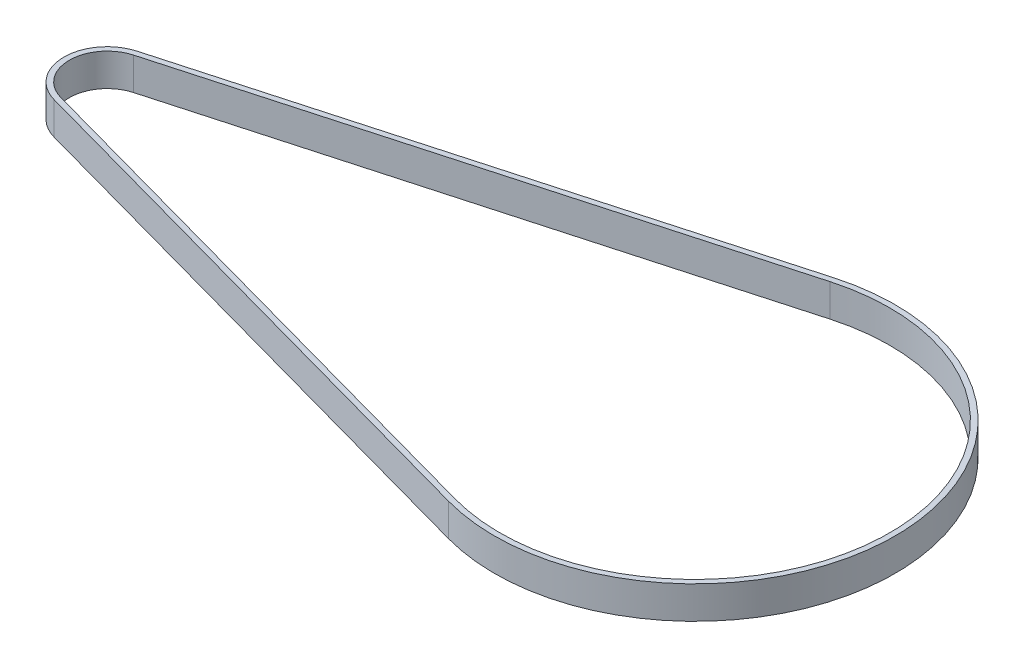
ISO-10303-21;
HEADER;
FILE_DESCRIPTION(('STEP AP214'),'2;1');
FILE_NAME('part.step','',(''),(''),'','','');
FILE_SCHEMA(('AUTOMOTIVE_DESIGN { 1 0 10303 214 1 1 1 1 }'));
ENDSEC;
DATA;
#1=APPLICATION_CONTEXT('core data for automotive mechanical design processes');
#2=APPLICATION_PROTOCOL_DEFINITION('international standard','automotive_design',2000,#1);
#3=PRODUCT_CONTEXT('',#1,'mechanical');
#4=PRODUCT('Part','Part','',(#3));
#5=PRODUCT_RELATED_PRODUCT_CATEGORY('part','',(#4));
#6=PRODUCT_DEFINITION_FORMATION('','',#4);
#7=PRODUCT_DEFINITION_CONTEXT('part definition',#1,'design');
#8=PRODUCT_DEFINITION('design','',#6,#7);
#9=PRODUCT_DEFINITION_SHAPE('','',#8);
#10=(LENGTH_UNIT() NAMED_UNIT(*) SI_UNIT(.MILLI.,.METRE.));
#11=(NAMED_UNIT(*) PLANE_ANGLE_UNIT() SI_UNIT($,.RADIAN.));
#12=(NAMED_UNIT(*) SI_UNIT($,.STERADIAN.) SOLID_ANGLE_UNIT());
#13=UNCERTAINTY_MEASURE_WITH_UNIT(LENGTH_MEASURE(1.E-05),#10,'distance_accuracy_value','');
#14=(GEOMETRIC_REPRESENTATION_CONTEXT(3) GLOBAL_UNCERTAINTY_ASSIGNED_CONTEXT((#13)) GLOBAL_UNIT_ASSIGNED_CONTEXT((#10,
#11,#12)) REPRESENTATION_CONTEXT('',''));
#15=CARTESIAN_POINT('',(0.,0.,0.));
#16=DIRECTION('',(0.,0.,1.));
#17=DIRECTION('',(1.,0.,0.));
#18=AXIS2_PLACEMENT_3D('',#15,#16,#17);
#19=CARTESIAN_POINT('',(1.78665644721282,6.,-7.76600496554805));
#20=DIRECTION('',(-0.26895630731804,0.,-0.963152378782217));
#21=DIRECTION('',(-0.963152378782217,0.,0.26895630731804));
#22=AXIS2_PLACEMENT_3D('',#19,#20,#21);
#23=PLANE('',#22);
#24=DIRECTION('',(0.963152378782217,0.,-0.26895630731804));
#25=VECTOR('',#24,1.);
#26=CARTESIAN_POINT('',(1.78665644721282,0.,-7.76600496554805));
#27=LINE('',#26,#25);
#28=CARTESIAN_POINT('',(1.78665644721282,0.,-7.76600496554804));
#29=VERTEX_POINT('',#28);
#30=CARTESIAN_POINT('',(102.348289540637,0.,-35.8474239502325));
#31=VERTEX_POINT('',#30);
#32=EDGE_CURVE('E155',#29,#31,#27,.T.);
#33=ORIENTED_EDGE('',*,*,#32,.F.);
#34=DIRECTION('',(0.,-1.,0.));
#35=VECTOR('',#34,1.);
#36=CARTESIAN_POINT('',(1.78665644721282,6.,-7.76600496554804));
#37=LINE('',#36,#35);
#38=CARTESIAN_POINT('',(1.78665644721282,6.,-7.76600496554804));
#39=VERTEX_POINT('',#38);
#40=EDGE_CURVE('E12',#39,#29,#37,.T.);
#41=ORIENTED_EDGE('',*,*,#40,.F.);
#42=DIRECTION('',(0.963152378782217,0.,-0.26895630731804));
#43=VECTOR('',#42,1.);
#44=CARTESIAN_POINT('',(1.78665644721282,6.,-7.76600496554805));
#45=LINE('',#44,#43);
#46=CARTESIAN_POINT('',(102.348289540637,6.,-35.8474239502325));
#47=VERTEX_POINT('',#46);
#48=EDGE_CURVE('E159',#39,#47,#45,.T.);
#49=ORIENTED_EDGE('',*,*,#48,.T.);
#50=DIRECTION('',(0.,-1.,0.));
#51=VECTOR('',#50,1.);
#52=CARTESIAN_POINT('',(102.348289540637,6.,-35.8474239502325));
#53=LINE('',#52,#51);
#54=EDGE_CURVE('E62',#47,#31,#53,.T.);
#55=ORIENTED_EDGE('',*,*,#54,.T.);
#56=EDGE_LOOP('',(#33,#41,#49,#55));
#57=FACE_BOUND('',#56,.T.);
#58=ADVANCED_FACE('F59',(#57),#23,.T.);
#59=CARTESIAN_POINT('',(3.93830690575714,6.,-0.0607859352902973));
#60=DIRECTION('',(0.,-1.,0.));
#61=DIRECTION('',(0.,0.,-1.));
#62=AXIS2_PLACEMENT_3D('',#59,#60,#61);
#63=CYLINDRICAL_SURFACE('',#62,8.);
#64=CARTESIAN_POINT('',(3.93830690575714,0.,-0.0607859352902973));
#65=DIRECTION('',(0.,1.,0.));
#66=DIRECTION('',(0.,0.,1.));
#67=AXIS2_PLACEMENT_3D('',#64,#65,#66);
#68=CIRCLE('',#67,8.);
#69=CARTESIAN_POINT('',(1.80799666185344,0.,7.65036042985665));
#70=VERTEX_POINT('',#69);
#71=EDGE_CURVE('E163',#29,#70,#68,.T.);
#72=ORIENTED_EDGE('',*,*,#71,.T.);
#73=DIRECTION('',(0.,-1.,0.));
#74=VECTOR('',#73,1.);
#75=CARTESIAN_POINT('',(1.80799666185344,6.,7.65036042985665));
#76=LINE('',#75,#74);
#77=CARTESIAN_POINT('',(1.80799666185344,6.,7.65036042985665));
#78=VERTEX_POINT('',#77);
#79=EDGE_CURVE('E67',#78,#70,#76,.T.);
#80=ORIENTED_EDGE('',*,*,#79,.F.);
#81=CARTESIAN_POINT('',(3.93830690575714,6.,-0.0607859352902973));
#82=DIRECTION('',(0.,1.,0.));
#83=DIRECTION('',(0.,0.,1.));
#84=AXIS2_PLACEMENT_3D('',#81,#82,#83);
#85=CIRCLE('',#84,8.);
#86=EDGE_CURVE('E167',#39,#78,#85,.T.);
#87=ORIENTED_EDGE('',*,*,#86,.F.);
#88=ORIENTED_EDGE('',*,*,#40,.T.);
#89=EDGE_LOOP('',(#72,#80,#87,#88));
#90=FACE_BOUND('',#89,.T.);
#91=ADVANCED_FACE('F195',(#90),#63,.T.);
#92=CARTESIAN_POINT('',(1.80799666185344,6.,7.65036042985665));
#93=DIRECTION('',(0.266288780487962,0.,-0.963893295643368));
#94=DIRECTION('',(-0.963893295643368,0.,-0.266288780487962));
#95=AXIS2_PLACEMENT_3D('',#92,#93,#94);
#96=PLANE('',#95);
#97=DIRECTION('',(0.963893295643368,0.,0.266288780487962));
#98=VECTOR('',#97,1.);
#99=CARTESIAN_POINT('',(1.80799666185344,0.,7.65036042985665));
#100=LINE('',#99,#98);
#101=CARTESIAN_POINT('',(102.446988033349,0.,35.4532660035143));
#102=VERTEX_POINT('',#101);
#103=EDGE_CURVE('E174',#70,#102,#100,.T.);
#104=ORIENTED_EDGE('',*,*,#103,.T.);
#105=DIRECTION('',(0.,-1.,0.));
#106=VECTOR('',#105,1.);
#107=CARTESIAN_POINT('',(102.446988033349,6.,35.4532660035143));
#108=LINE('',#107,#106);
#109=CARTESIAN_POINT('',(102.446988033349,6.,35.4532660035143));
#110=VERTEX_POINT('',#109);
#111=EDGE_CURVE('E178',#110,#102,#108,.T.);
#112=ORIENTED_EDGE('',*,*,#111,.F.);
#113=DIRECTION('',(0.963893295643368,0.,0.266288780487962));
#114=VECTOR('',#113,1.);
#115=CARTESIAN_POINT('',(1.80799666185344,6.,7.65036042985665));
#116=LINE('',#115,#114);
#117=EDGE_CURVE('E165',#78,#110,#116,.T.);
#118=ORIENTED_EDGE('',*,*,#117,.F.);
#119=ORIENTED_EDGE('',*,*,#79,.T.);
#120=EDGE_LOOP('',(#104,#112,#118,#119));
#121=FACE_BOUND('',#120,.T.);
#122=ADVANCED_FACE('F199',(#121),#96,.F.);
#123=CARTESIAN_POINT('',(112.299672911404,6.,-0.210785935290496));
#124=DIRECTION('',(0.,-1.,0.));
#125=DIRECTION('',(0.,0.,-1.));
#126=AXIS2_PLACEMENT_3D('',#123,#124,#125);
#127=CYLINDRICAL_SURFACE('',#126,37.);
#128=CARTESIAN_POINT('',(112.299672911404,0.,-0.210785935290496));
#129=DIRECTION('',(0.,1.,0.));
#130=DIRECTION('',(0.,0.,1.));
#131=AXIS2_PLACEMENT_3D('',#128,#129,#130);
#132=CIRCLE('',#131,37.);
#133=EDGE_CURVE('E171',#102,#31,#132,.T.);
#134=ORIENTED_EDGE('',*,*,#133,.T.);
#135=ORIENTED_EDGE('',*,*,#54,.F.);
#136=CARTESIAN_POINT('',(112.299672911404,6.,-0.210785935290496));
#137=DIRECTION('',(0.,1.,0.));
#138=DIRECTION('',(0.,0.,1.));
#139=AXIS2_PLACEMENT_3D('',#136,#137,#138);
#140=CIRCLE('',#139,37.);
#141=EDGE_CURVE('E162',#110,#47,#140,.T.);
#142=ORIENTED_EDGE('',*,*,#141,.F.);
#143=ORIENTED_EDGE('',*,*,#111,.T.);
#144=EDGE_LOOP('',(#134,#135,#142,#143));
#145=FACE_BOUND('',#144,.T.);
#146=ADVANCED_FACE('F188',(#145),#127,.T.);
#147=CARTESIAN_POINT('',(112.299672911404,6.,-0.210785935290496));
#148=DIRECTION('',(0.,1.,0.));
#149=DIRECTION('',(0.,0.,1.));
#150=AXIS2_PLACEMENT_3D('',#147,#148,#149);
#151=PLANE('',#150);
#152=DIRECTION('',(0.963152378782217,0.,-0.26895630731804));
#153=VECTOR('',#152,1.);
#154=CARTESIAN_POINT('',(2.05561275453086,6.,-6.80285258676583));
#155=LINE('',#154,#153);
#156=CARTESIAN_POINT('',(2.05561275453086,6.,-6.80285258676583));
#157=VERTEX_POINT('',#156);
#158=CARTESIAN_POINT('',(102.617245847955,6.,-34.8842715714502));
#159=VERTEX_POINT('',#158);
#160=EDGE_CURVE('E131',#157,#159,#155,.T.);
#161=ORIENTED_EDGE('',*,*,#160,.T.);
#162=CARTESIAN_POINT('',(112.299672911404,6.,-0.210785935290347));
#163=DIRECTION('',(0.,1.,0.));
#164=DIRECTION('',(0.,0.,1.));
#165=AXIS2_PLACEMENT_3D('',#162,#163,#164);
#166=CIRCLE('',#165,36.);
#167=CARTESIAN_POINT('',(102.713276813837,6.,34.4893727078709));
#168=VERTEX_POINT('',#167);
#169=EDGE_CURVE('E123',#168,#159,#166,.T.);
#170=ORIENTED_EDGE('',*,*,#169,.F.);
#171=DIRECTION('',(0.963893295643368,0.,0.266288780487962));
#172=VECTOR('',#171,1.);
#173=CARTESIAN_POINT('',(2.0742854423414,6.,6.68646713421328));
#174=LINE('',#173,#172);
#175=CARTESIAN_POINT('',(2.0742854423414,6.,6.68646713421329));
#176=VERTEX_POINT('',#175);
#177=EDGE_CURVE('E130',#176,#168,#174,.T.);
#178=ORIENTED_EDGE('',*,*,#177,.F.);
#179=CARTESIAN_POINT('',(3.93830690575714,6.,-0.0607859352902973));
#180=DIRECTION('',(0.,1.,0.));
#181=DIRECTION('',(0.,0.,1.));
#182=AXIS2_PLACEMENT_3D('',#179,#180,#181);
#183=CIRCLE('',#182,7.);
#184=EDGE_CURVE('E136',#157,#176,#183,.T.);
#185=ORIENTED_EDGE('',*,*,#184,.F.);
#186=EDGE_LOOP('',(#161,#170,#178,#185));
#187=FACE_BOUND('',#186,.T.);
#188=ORIENTED_EDGE('',*,*,#48,.F.);
#189=ORIENTED_EDGE('',*,*,#86,.T.);
#190=ORIENTED_EDGE('',*,*,#117,.T.);
#191=ORIENTED_EDGE('',*,*,#141,.T.);
#192=EDGE_LOOP('',(#188,#189,#190,#191));
#193=FACE_BOUND('',#192,.T.);
#194=ADVANCED_FACE('F138',(#187,#193),#151,.T.);
#195=CARTESIAN_POINT('',(112.299672911404,0.,-0.210785935290496));
#196=DIRECTION('',(0.,1.,0.));
#197=DIRECTION('',(0.,0.,1.));
#198=AXIS2_PLACEMENT_3D('',#195,#196,#197);
#199=PLANE('',#198);
#200=CARTESIAN_POINT('',(112.299672911404,0.,-0.210785935290347));
#201=DIRECTION('',(0.,1.,0.));
#202=DIRECTION('',(0.,0.,1.));
#203=AXIS2_PLACEMENT_3D('',#200,#201,#202);
#204=CIRCLE('',#203,36.);
#205=CARTESIAN_POINT('',(102.713276813837,0.,34.4893727078709));
#206=VERTEX_POINT('',#205);
#207=CARTESIAN_POINT('',(102.617245847955,0.,-34.8842715714502));
#208=VERTEX_POINT('',#207);
#209=EDGE_CURVE('E149',#206,#208,#204,.T.);
#210=ORIENTED_EDGE('',*,*,#209,.T.);
#211=DIRECTION('',(0.963152378782217,0.,-0.26895630731804));
#212=VECTOR('',#211,1.);
#213=CARTESIAN_POINT('',(2.05561275453086,0.,-6.80285258676583));
#214=LINE('',#213,#212);
#215=CARTESIAN_POINT('',(2.05561275453086,0.,-6.80285258676583));
#216=VERTEX_POINT('',#215);
#217=EDGE_CURVE('E83',#216,#208,#214,.T.);
#218=ORIENTED_EDGE('',*,*,#217,.F.);
#219=CARTESIAN_POINT('',(3.93830690575714,0.,-0.0607859352902973));
#220=DIRECTION('',(0.,1.,0.));
#221=DIRECTION('',(0.,0.,1.));
#222=AXIS2_PLACEMENT_3D('',#219,#220,#221);
#223=CIRCLE('',#222,7.);
#224=CARTESIAN_POINT('',(2.0742854423414,0.,6.68646713421329));
#225=VERTEX_POINT('',#224);
#226=EDGE_CURVE('E140',#216,#225,#223,.T.);
#227=ORIENTED_EDGE('',*,*,#226,.T.);
#228=DIRECTION('',(0.963893295643368,0.,0.266288780487962));
#229=VECTOR('',#228,1.);
#230=CARTESIAN_POINT('',(2.0742854423414,0.,6.68646713421328));
#231=LINE('',#230,#229);
#232=EDGE_CURVE('E143',#225,#206,#231,.T.);
#233=ORIENTED_EDGE('',*,*,#232,.T.);
#234=EDGE_LOOP('',(#210,#218,#227,#233));
#235=FACE_BOUND('',#234,.T.);
#236=ORIENTED_EDGE('',*,*,#32,.T.);
#237=ORIENTED_EDGE('',*,*,#133,.F.);
#238=ORIENTED_EDGE('',*,*,#103,.F.);
#239=ORIENTED_EDGE('',*,*,#71,.F.);
#240=EDGE_LOOP('',(#236,#237,#238,#239));
#241=FACE_BOUND('',#240,.T.);
#242=ADVANCED_FACE('F192',(#235,#241),#199,.F.);
#243=CARTESIAN_POINT('',(2.05561275453086,6.,-6.80285258676583));
#244=DIRECTION('',(-0.26895630731804,0.,-0.963152378782217));
#245=DIRECTION('',(-0.963152378782217,0.,0.26895630731804));
#246=AXIS2_PLACEMENT_3D('',#243,#244,#245);
#247=PLANE('',#246);
#248=ORIENTED_EDGE('',*,*,#217,.T.);
#249=DIRECTION('',(0.,-1.,0.));
#250=VECTOR('',#249,1.);
#251=CARTESIAN_POINT('',(102.617245847955,6.,-34.8842715714502));
#252=LINE('',#251,#250);
#253=EDGE_CURVE('E125',#159,#208,#252,.T.);
#254=ORIENTED_EDGE('',*,*,#253,.F.);
#255=ORIENTED_EDGE('',*,*,#160,.F.);
#256=DIRECTION('',(0.,-1.,0.));
#257=VECTOR('',#256,1.);
#258=CARTESIAN_POINT('',(2.05561275453086,6.,-6.80285258676583));
#259=LINE('',#258,#257);
#260=EDGE_CURVE('E153',#157,#216,#259,.T.);
#261=ORIENTED_EDGE('',*,*,#260,.T.);
#262=EDGE_LOOP('',(#248,#254,#255,#261));
#263=FACE_BOUND('',#262,.T.);
#264=ADVANCED_FACE('F134',(#263),#247,.F.);
#265=CARTESIAN_POINT('',(3.93830690575714,6.,-0.0607859352902973));
#266=DIRECTION('',(0.,-1.,0.));
#267=DIRECTION('',(0.,0.,-1.));
#268=AXIS2_PLACEMENT_3D('',#265,#266,#267);
#269=CYLINDRICAL_SURFACE('',#268,7.);
#270=ORIENTED_EDGE('',*,*,#226,.F.);
#271=ORIENTED_EDGE('',*,*,#260,.F.);
#272=ORIENTED_EDGE('',*,*,#184,.T.);
#273=DIRECTION('',(0.,-1.,0.));
#274=VECTOR('',#273,1.);
#275=CARTESIAN_POINT('',(2.0742854423414,6.,6.68646713421329));
#276=LINE('',#275,#274);
#277=EDGE_CURVE('E156',#176,#225,#276,.T.);
#278=ORIENTED_EDGE('',*,*,#277,.T.);
#279=EDGE_LOOP('',(#270,#271,#272,#278));
#280=FACE_BOUND('',#279,.T.);
#281=ADVANCED_FACE('F243',(#280),#269,.F.);
#282=CARTESIAN_POINT('',(2.0742854423414,6.,6.68646713421328));
#283=DIRECTION('',(0.266288780487962,0.,-0.963893295643368));
#284=DIRECTION('',(-0.963893295643368,0.,-0.266288780487962));
#285=AXIS2_PLACEMENT_3D('',#282,#283,#284);
#286=PLANE('',#285);
#287=ORIENTED_EDGE('',*,*,#232,.F.);
#288=ORIENTED_EDGE('',*,*,#277,.F.);
#289=ORIENTED_EDGE('',*,*,#177,.T.);
#290=DIRECTION('',(0.,-1.,0.));
#291=VECTOR('',#290,1.);
#292=CARTESIAN_POINT('',(102.713276813837,6.,34.4893727078709));
#293=LINE('',#292,#291);
#294=EDGE_CURVE('E75',#168,#206,#293,.T.);
#295=ORIENTED_EDGE('',*,*,#294,.T.);
#296=EDGE_LOOP('',(#287,#288,#289,#295));
#297=FACE_BOUND('',#296,.T.);
#298=ADVANCED_FACE('F251',(#297),#286,.T.);
#299=CARTESIAN_POINT('',(112.299672911404,6.,-0.210785935290347));
#300=DIRECTION('',(0.,-1.,0.));
#301=DIRECTION('',(0.,0.,-1.));
#302=AXIS2_PLACEMENT_3D('',#299,#300,#301);
#303=CYLINDRICAL_SURFACE('',#302,36.);
#304=ORIENTED_EDGE('',*,*,#209,.F.);
#305=ORIENTED_EDGE('',*,*,#294,.F.);
#306=ORIENTED_EDGE('',*,*,#169,.T.);
#307=ORIENTED_EDGE('',*,*,#253,.T.);
#308=EDGE_LOOP('',(#304,#305,#306,#307));
#309=FACE_BOUND('',#308,.T.);
#310=ADVANCED_FACE('F124',(#309),#303,.F.);
#311=CLOSED_SHELL('',(#58,#91,#122,#146,#194,#242,#264,#281,#298,#310));
#312=MANIFOLD_SOLID_BREP('B2',#311);
#313=ADVANCED_BREP_SHAPE_REPRESENTATION('',(#18,#312),#14);
#314=SHAPE_DEFINITION_REPRESENTATION(#9,#313);
ENDSEC;
END-ISO-10303-21;
